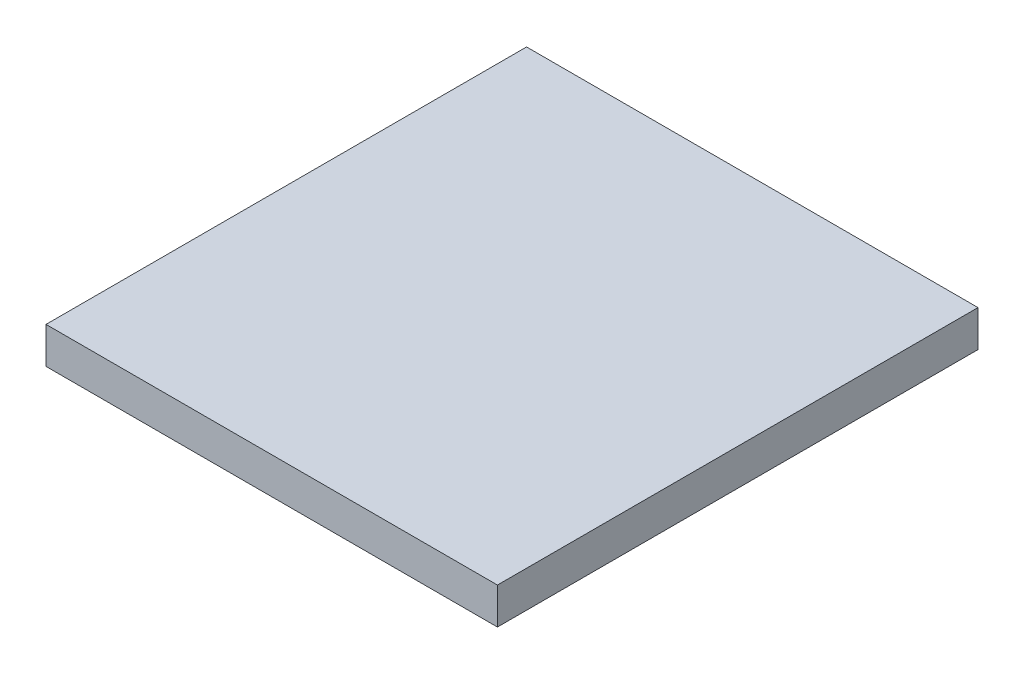
ISO-10303-21;
HEADER;
FILE_DESCRIPTION(('STEP AP214'),'2;1');
FILE_NAME('part.step','',(''),(''),'','','');
FILE_SCHEMA(('AUTOMOTIVE_DESIGN { 1 0 10303 214 1 1 1 1 }'));
ENDSEC;
DATA;
#1=APPLICATION_CONTEXT('core data for automotive mechanical design processes');
#2=APPLICATION_PROTOCOL_DEFINITION('international standard','automotive_design',2000,#1);
#3=PRODUCT_CONTEXT('',#1,'mechanical');
#4=PRODUCT('Part','Part','',(#3));
#5=PRODUCT_RELATED_PRODUCT_CATEGORY('part','',(#4));
#6=PRODUCT_DEFINITION_FORMATION('','',#4);
#7=PRODUCT_DEFINITION_CONTEXT('part definition',#1,'design');
#8=PRODUCT_DEFINITION('design','',#6,#7);
#9=PRODUCT_DEFINITION_SHAPE('','',#8);
#10=(LENGTH_UNIT() NAMED_UNIT(*) SI_UNIT(.MILLI.,.METRE.));
#11=(NAMED_UNIT(*) PLANE_ANGLE_UNIT() SI_UNIT($,.RADIAN.));
#12=(NAMED_UNIT(*) SI_UNIT($,.STERADIAN.) SOLID_ANGLE_UNIT());
#13=UNCERTAINTY_MEASURE_WITH_UNIT(LENGTH_MEASURE(1.E-05),#10,'distance_accuracy_value','');
#14=(GEOMETRIC_REPRESENTATION_CONTEXT(3) GLOBAL_UNCERTAINTY_ASSIGNED_CONTEXT((#13)) GLOBAL_UNIT_ASSIGNED_CONTEXT((#10,
#11,#12)) REPRESENTATION_CONTEXT('',''));
#15=CARTESIAN_POINT('',(0.,0.,0.));
#16=DIRECTION('',(0.,0.,1.));
#17=DIRECTION('',(1.,0.,0.));
#18=AXIS2_PLACEMENT_3D('',#15,#16,#17);
#19=CARTESIAN_POINT('',(62.,5.,0.));
#20=DIRECTION('',(0.,0.,-1.));
#21=DIRECTION('',(-1.,0.,0.));
#22=AXIS2_PLACEMENT_3D('',#19,#20,#21);
#23=PLANE('',#22);
#24=DIRECTION('',(1.,0.,0.));
#25=VECTOR('',#24,1.);
#26=CARTESIAN_POINT('',(62.,0.,0.));
#27=LINE('',#26,#25);
#28=CARTESIAN_POINT('',(0.,0.,0.));
#29=VERTEX_POINT('',#28);
#30=CARTESIAN_POINT('',(62.,0.,0.));
#31=VERTEX_POINT('',#30);
#32=EDGE_CURVE('E97',#29,#31,#27,.T.);
#33=ORIENTED_EDGE('',*,*,#32,.T.);
#34=DIRECTION('',(0.,-1.,0.));
#35=VECTOR('',#34,1.);
#36=CARTESIAN_POINT('',(62.,5.,0.));
#37=LINE('',#36,#35);
#38=CARTESIAN_POINT('',(62.,5.,0.));
#39=VERTEX_POINT('',#38);
#40=EDGE_CURVE('E11',#39,#31,#37,.T.);
#41=ORIENTED_EDGE('',*,*,#40,.F.);
#42=DIRECTION('',(1.,0.,0.));
#43=VECTOR('',#42,1.);
#44=CARTESIAN_POINT('',(62.,5.,0.));
#45=LINE('',#44,#43);
#46=CARTESIAN_POINT('',(0.,5.,0.));
#47=VERTEX_POINT('',#46);
#48=EDGE_CURVE('E85',#47,#39,#45,.T.);
#49=ORIENTED_EDGE('',*,*,#48,.F.);
#50=DIRECTION('',(0.,-1.,0.));
#51=VECTOR('',#50,1.);
#52=CARTESIAN_POINT('',(0.,5.,0.));
#53=LINE('',#52,#51);
#54=EDGE_CURVE('E93',#47,#29,#53,.T.);
#55=ORIENTED_EDGE('',*,*,#54,.T.);
#56=EDGE_LOOP('',(#33,#41,#49,#55));
#57=FACE_BOUND('',#56,.T.);
#58=ADVANCED_FACE('F34',(#57),#23,.F.);
#59=CARTESIAN_POINT('',(62.,5.,-66.));
#60=DIRECTION('',(-1.,0.,0.));
#61=DIRECTION('',(0.,0.,1.));
#62=AXIS2_PLACEMENT_3D('',#59,#60,#61);
#63=PLANE('',#62);
#64=DIRECTION('',(0.,0.,-1.));
#65=VECTOR('',#64,1.);
#66=CARTESIAN_POINT('',(62.,0.,-66.));
#67=LINE('',#66,#65);
#68=CARTESIAN_POINT('',(62.,0.,-66.));
#69=VERTEX_POINT('',#68);
#70=EDGE_CURVE('E89',#31,#69,#67,.T.);
#71=ORIENTED_EDGE('',*,*,#70,.T.);
#72=DIRECTION('',(0.,-1.,0.));
#73=VECTOR('',#72,1.);
#74=CARTESIAN_POINT('',(62.,5.,-66.));
#75=LINE('',#74,#73);
#76=CARTESIAN_POINT('',(62.,5.,-66.));
#77=VERTEX_POINT('',#76);
#78=EDGE_CURVE('E42',#77,#69,#75,.T.);
#79=ORIENTED_EDGE('',*,*,#78,.F.);
#80=DIRECTION('',(0.,0.,-1.));
#81=VECTOR('',#80,1.);
#82=CARTESIAN_POINT('',(62.,5.,-66.));
#83=LINE('',#82,#81);
#84=EDGE_CURVE('E80',#39,#77,#83,.T.);
#85=ORIENTED_EDGE('',*,*,#84,.F.);
#86=ORIENTED_EDGE('',*,*,#40,.T.);
#87=EDGE_LOOP('',(#71,#79,#85,#86));
#88=FACE_BOUND('',#87,.T.);
#89=ADVANCED_FACE('F88',(#88),#63,.F.);
#90=CARTESIAN_POINT('',(0.,5.,-66.));
#91=DIRECTION('',(0.,0.,1.));
#92=DIRECTION('',(1.,0.,0.));
#93=AXIS2_PLACEMENT_3D('',#90,#91,#92);
#94=PLANE('',#93);
#95=DIRECTION('',(-1.,0.,0.));
#96=VECTOR('',#95,1.);
#97=CARTESIAN_POINT('',(0.,0.,-66.));
#98=LINE('',#97,#96);
#99=CARTESIAN_POINT('',(0.,0.,-66.));
#100=VERTEX_POINT('',#99);
#101=EDGE_CURVE('E67',#69,#100,#98,.T.);
#102=ORIENTED_EDGE('',*,*,#101,.T.);
#103=DIRECTION('',(0.,-1.,0.));
#104=VECTOR('',#103,1.);
#105=CARTESIAN_POINT('',(0.,5.,-66.));
#106=LINE('',#105,#104);
#107=CARTESIAN_POINT('',(0.,5.,-66.));
#108=VERTEX_POINT('',#107);
#109=EDGE_CURVE('E90',#108,#100,#106,.T.);
#110=ORIENTED_EDGE('',*,*,#109,.F.);
#111=DIRECTION('',(-1.,0.,0.));
#112=VECTOR('',#111,1.);
#113=CARTESIAN_POINT('',(0.,5.,-66.));
#114=LINE('',#113,#112);
#115=EDGE_CURVE('E83',#77,#108,#114,.T.);
#116=ORIENTED_EDGE('',*,*,#115,.F.);
#117=ORIENTED_EDGE('',*,*,#78,.T.);
#118=EDGE_LOOP('',(#102,#110,#116,#117));
#119=FACE_BOUND('',#118,.T.);
#120=ADVANCED_FACE('F91',(#119),#94,.F.);
#121=CARTESIAN_POINT('',(0.,5.,0.));
#122=DIRECTION('',(1.,0.,0.));
#123=DIRECTION('',(0.,0.,-1.));
#124=AXIS2_PLACEMENT_3D('',#121,#122,#123);
#125=PLANE('',#124);
#126=DIRECTION('',(0.,0.,1.));
#127=VECTOR('',#126,1.);
#128=CARTESIAN_POINT('',(0.,0.,0.));
#129=LINE('',#128,#127);
#130=EDGE_CURVE('E73',#100,#29,#129,.T.);
#131=ORIENTED_EDGE('',*,*,#130,.T.);
#132=ORIENTED_EDGE('',*,*,#54,.F.);
#133=DIRECTION('',(0.,0.,1.));
#134=VECTOR('',#133,1.);
#135=CARTESIAN_POINT('',(0.,5.,0.));
#136=LINE('',#135,#134);
#137=EDGE_CURVE('E50',#108,#47,#136,.T.);
#138=ORIENTED_EDGE('',*,*,#137,.F.);
#139=ORIENTED_EDGE('',*,*,#109,.T.);
#140=EDGE_LOOP('',(#131,#132,#138,#139));
#141=FACE_BOUND('',#140,.T.);
#142=ADVANCED_FACE('F104',(#141),#125,.F.);
#143=CARTESIAN_POINT('',(0.,5.,0.));
#144=DIRECTION('',(0.,-1.,0.));
#145=DIRECTION('',(0.,0.,-1.));
#146=AXIS2_PLACEMENT_3D('',#143,#144,#145);
#147=PLANE('',#146);
#148=ORIENTED_EDGE('',*,*,#48,.T.);
#149=ORIENTED_EDGE('',*,*,#84,.T.);
#150=ORIENTED_EDGE('',*,*,#115,.T.);
#151=ORIENTED_EDGE('',*,*,#137,.T.);
#152=EDGE_LOOP('',(#148,#149,#150,#151));
#153=FACE_BOUND('',#152,.T.);
#154=ADVANCED_FACE('F81',(#153),#147,.F.);
#155=CARTESIAN_POINT('',(0.,0.,0.));
#156=DIRECTION('',(0.,-1.,0.));
#157=DIRECTION('',(0.,0.,-1.));
#158=AXIS2_PLACEMENT_3D('',#155,#156,#157);
#159=PLANE('',#158);
#160=ORIENTED_EDGE('',*,*,#32,.F.);
#161=ORIENTED_EDGE('',*,*,#130,.F.);
#162=ORIENTED_EDGE('',*,*,#101,.F.);
#163=ORIENTED_EDGE('',*,*,#70,.F.);
#164=EDGE_LOOP('',(#160,#161,#162,#163));
#165=FACE_BOUND('',#164,.T.);
#166=ADVANCED_FACE('F107',(#165),#159,.T.);
#167=CLOSED_SHELL('',(#58,#89,#120,#142,#154,#166));
#168=MANIFOLD_SOLID_BREP('B2',#167);
#169=ADVANCED_BREP_SHAPE_REPRESENTATION('',(#18,#168),#14);
#170=SHAPE_DEFINITION_REPRESENTATION(#9,#169);
ENDSEC;
END-ISO-10303-21;
